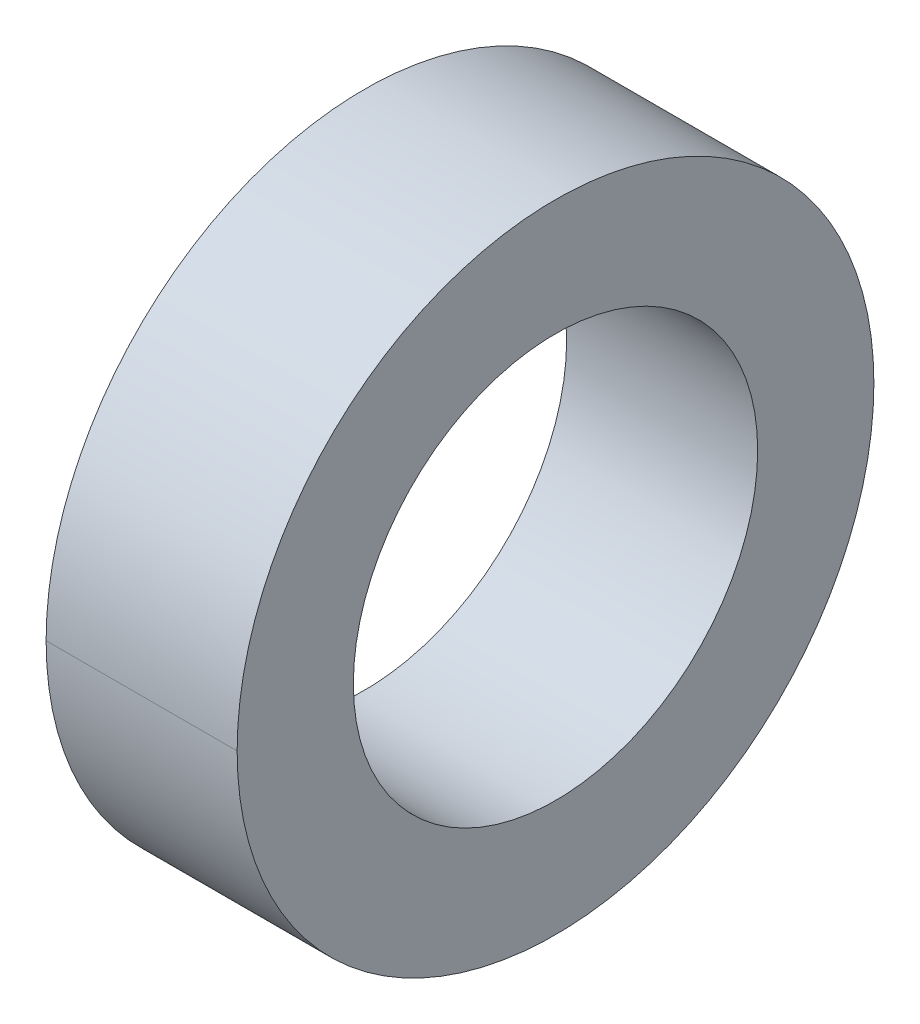
ISO-10303-21;
HEADER;
FILE_DESCRIPTION(('STEP AP214'),'2;1');
FILE_NAME('part.step','',(''),(''),'','','');
FILE_SCHEMA(('AUTOMOTIVE_DESIGN { 1 0 10303 214 1 1 1 1 }'));
ENDSEC;
DATA;
#1=APPLICATION_CONTEXT('core data for automotive mechanical design processes');
#2=APPLICATION_PROTOCOL_DEFINITION('international standard','automotive_design',2000,#1);
#3=PRODUCT_CONTEXT('',#1,'mechanical');
#4=PRODUCT('Part','Part','',(#3));
#5=PRODUCT_RELATED_PRODUCT_CATEGORY('part','',(#4));
#6=PRODUCT_DEFINITION_FORMATION('','',#4);
#7=PRODUCT_DEFINITION_CONTEXT('part definition',#1,'design');
#8=PRODUCT_DEFINITION('design','',#6,#7);
#9=PRODUCT_DEFINITION_SHAPE('','',#8);
#10=(LENGTH_UNIT() NAMED_UNIT(*) SI_UNIT(.MILLI.,.METRE.));
#11=(NAMED_UNIT(*) PLANE_ANGLE_UNIT() SI_UNIT($,.RADIAN.));
#12=(NAMED_UNIT(*) SI_UNIT($,.STERADIAN.) SOLID_ANGLE_UNIT());
#13=UNCERTAINTY_MEASURE_WITH_UNIT(LENGTH_MEASURE(1.E-05),#10,'distance_accuracy_value','');
#14=(GEOMETRIC_REPRESENTATION_CONTEXT(3) GLOBAL_UNCERTAINTY_ASSIGNED_CONTEXT((#13)) GLOBAL_UNIT_ASSIGNED_CONTEXT((#10,
#11,#12)) REPRESENTATION_CONTEXT('',''));
#15=CARTESIAN_POINT('',(0.,0.,0.));
#16=DIRECTION('',(0.,0.,1.));
#17=DIRECTION('',(1.,0.,0.));
#18=AXIS2_PLACEMENT_3D('',#15,#16,#17);
#19=CARTESIAN_POINT('',(3.,0.,0.));
#20=DIRECTION('',(-1.,0.,0.));
#21=DIRECTION('',(0.,0.,1.));
#22=AXIS2_PLACEMENT_3D('',#19,#20,#21);
#23=CYLINDRICAL_SURFACE('',#22,5.);
#24=DIRECTION('',(-1.,0.,0.));
#25=VECTOR('',#24,1.);
#26=CARTESIAN_POINT('',(3.,0.,-5.));
#27=LINE('',#26,#25);
#28=CARTESIAN_POINT('',(0.,0.,-5.));
#29=VERTEX_POINT('',#28);
#30=CARTESIAN_POINT('',(3.,0.,-5.));
#31=VERTEX_POINT('',#30);
#32=EDGE_CURVE('E61',#29,#31,#27,.F.);
#33=ORIENTED_EDGE('',*,*,#32,.T.);
#34=CARTESIAN_POINT('',(3.,0.,0.));
#35=DIRECTION('',(1.,0.,0.));
#36=DIRECTION('',(0.,0.,-1.));
#37=AXIS2_PLACEMENT_3D('',#34,#35,#36);
#38=CIRCLE('',#37,5.);
#39=CARTESIAN_POINT('',(3.,0.,5.));
#40=VERTEX_POINT('',#39);
#41=EDGE_CURVE('E44',#40,#31,#38,.T.);
#42=ORIENTED_EDGE('',*,*,#41,.F.);
#43=DIRECTION('',(1.,0.,0.));
#44=VECTOR('',#43,1.);
#45=CARTESIAN_POINT('',(0.,0.,5.));
#46=LINE('',#45,#44);
#47=CARTESIAN_POINT('',(0.,0.,5.));
#48=VERTEX_POINT('',#47);
#49=EDGE_CURVE('E63',#40,#48,#46,.F.);
#50=ORIENTED_EDGE('',*,*,#49,.T.);
#51=CARTESIAN_POINT('',(0.,0.,0.));
#52=DIRECTION('',(1.,0.,0.));
#53=DIRECTION('',(0.,0.,-1.));
#54=AXIS2_PLACEMENT_3D('',#51,#52,#53);
#55=CIRCLE('',#54,5.);
#56=EDGE_CURVE('E11',#29,#48,#55,.F.);
#57=ORIENTED_EDGE('',*,*,#56,.F.);
#58=EDGE_LOOP('',(#33,#42,#50,#57));
#59=FACE_BOUND('',#58,.T.);
#60=ADVANCED_FACE('F36',(#59),#23,.T.);
#61=CARTESIAN_POINT('',(0.,0.,0.));
#62=DIRECTION('',(-1.,0.,0.));
#63=DIRECTION('',(0.,0.,1.));
#64=AXIS2_PLACEMENT_3D('',#61,#62,#63);
#65=CYLINDRICAL_SURFACE('',#64,5.);
#66=ORIENTED_EDGE('',*,*,#32,.F.);
#67=CARTESIAN_POINT('',(0.,0.,0.));
#68=DIRECTION('',(1.,0.,0.));
#69=DIRECTION('',(0.,0.,-1.));
#70=AXIS2_PLACEMENT_3D('',#67,#68,#69);
#71=CIRCLE('',#70,5.);
#72=EDGE_CURVE('E64',#48,#29,#71,.F.);
#73=ORIENTED_EDGE('',*,*,#72,.F.);
#74=ORIENTED_EDGE('',*,*,#49,.F.);
#75=CARTESIAN_POINT('',(3.,0.,0.));
#76=DIRECTION('',(1.,0.,0.));
#77=DIRECTION('',(0.,0.,-1.));
#78=AXIS2_PLACEMENT_3D('',#75,#76,#77);
#79=CIRCLE('',#78,5.);
#80=EDGE_CURVE('E67',#31,#40,#79,.T.);
#81=ORIENTED_EDGE('',*,*,#80,.F.);
#82=EDGE_LOOP('',(#66,#73,#74,#81));
#83=FACE_BOUND('',#82,.T.);
#84=ADVANCED_FACE('F70',(#83),#65,.T.);
#85=CARTESIAN_POINT('',(3.,0.,0.));
#86=DIRECTION('',(1.,0.,0.));
#87=DIRECTION('',(0.,0.,-1.));
#88=AXIS2_PLACEMENT_3D('',#85,#86,#87);
#89=PLANE('',#88);
#90=CARTESIAN_POINT('',(3.,0.,0.));
#91=DIRECTION('',(1.,0.,0.));
#92=DIRECTION('',(0.,0.,-1.));
#93=AXIS2_PLACEMENT_3D('',#90,#91,#92);
#94=CIRCLE('',#93,3.175);
#95=CARTESIAN_POINT('',(3.,0.,-3.175));
#96=VERTEX_POINT('',#95);
#97=EDGE_CURVE('E71',#96,#96,#94,.T.);
#98=ORIENTED_EDGE('',*,*,#97,.F.);
#99=EDGE_LOOP('',(#98));
#100=FACE_BOUND('',#99,.T.);
#101=ORIENTED_EDGE('',*,*,#80,.T.);
#102=ORIENTED_EDGE('',*,*,#41,.T.);
#103=EDGE_LOOP('',(#101,#102));
#104=FACE_BOUND('',#103,.T.);
#105=ADVANCED_FACE('F80',(#100,#104),#89,.T.);
#106=CARTESIAN_POINT('',(0.,0.,0.));
#107=DIRECTION('',(1.,0.,0.));
#108=DIRECTION('',(0.,0.,-1.));
#109=AXIS2_PLACEMENT_3D('',#106,#107,#108);
#110=PLANE('',#109);
#111=CARTESIAN_POINT('',(0.,0.,0.));
#112=DIRECTION('',(-1.,0.,0.));
#113=DIRECTION('',(0.,0.,1.));
#114=AXIS2_PLACEMENT_3D('',#111,#112,#113);
#115=CIRCLE('',#114,3.175);
#116=CARTESIAN_POINT('',(0.,0.,3.175));
#117=VERTEX_POINT('',#116);
#118=EDGE_CURVE('E75',#117,#117,#115,.T.);
#119=ORIENTED_EDGE('',*,*,#118,.F.);
#120=EDGE_LOOP('',(#119));
#121=FACE_BOUND('',#120,.T.);
#122=ORIENTED_EDGE('',*,*,#72,.T.);
#123=ORIENTED_EDGE('',*,*,#56,.T.);
#124=EDGE_LOOP('',(#122,#123));
#125=FACE_BOUND('',#124,.T.);
#126=ADVANCED_FACE('F65',(#121,#125),#110,.F.);
#127=CARTESIAN_POINT('',(10.,0.,0.));
#128=DIRECTION('',(-1.,0.,0.));
#129=DIRECTION('',(0.,0.,1.));
#130=AXIS2_PLACEMENT_3D('',#127,#128,#129);
#131=CYLINDRICAL_SURFACE('',#130,3.175);
#132=ORIENTED_EDGE('',*,*,#97,.T.);
#133=EDGE_LOOP('',(#132));
#134=FACE_BOUND('',#133,.T.);
#135=ORIENTED_EDGE('',*,*,#118,.T.);
#136=EDGE_LOOP('',(#135));
#137=FACE_BOUND('',#136,.T.);
#138=ADVANCED_FACE('F88',(#134,#137),#131,.F.);
#139=CLOSED_SHELL('',(#60,#84,#105,#126,#138));
#140=MANIFOLD_SOLID_BREP('B2',#139);
#141=ADVANCED_BREP_SHAPE_REPRESENTATION('',(#18,#140),#14);
#142=SHAPE_DEFINITION_REPRESENTATION(#9,#141);
ENDSEC;
END-ISO-10303-21;
